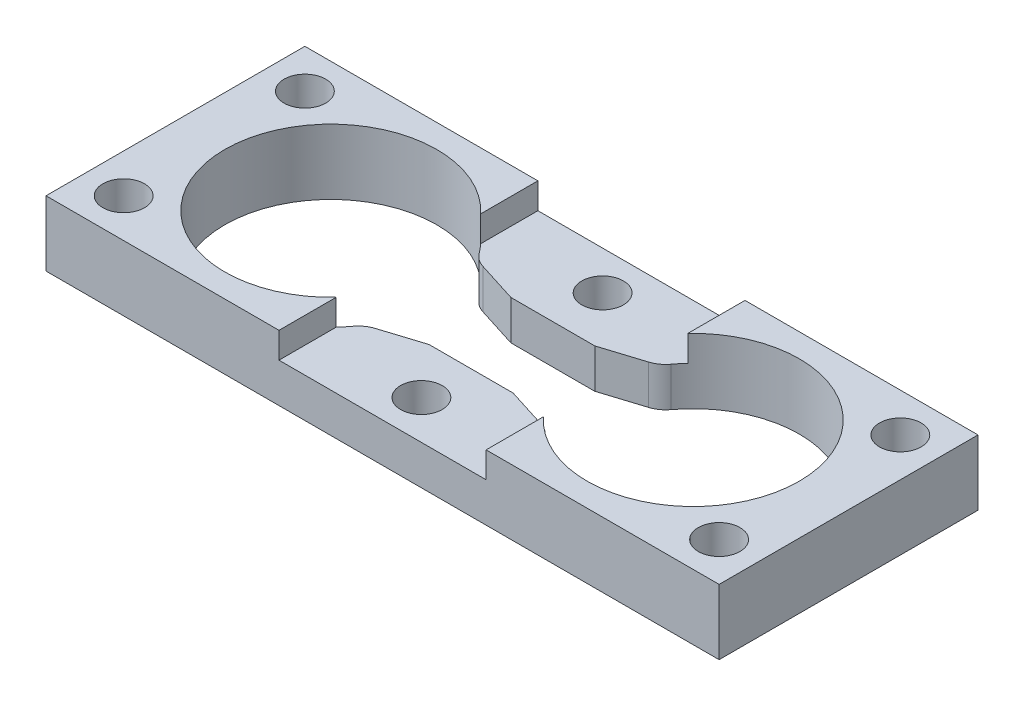
ISO-10303-21;
HEADER;
FILE_DESCRIPTION(('STEP AP214'),'2;1');
FILE_NAME('part.step','',(''),(''),'','','');
FILE_SCHEMA(('AUTOMOTIVE_DESIGN { 1 0 10303 214 1 1 1 1 }'));
ENDSEC;
DATA;
#1=APPLICATION_CONTEXT('core data for automotive mechanical design processes');
#2=APPLICATION_PROTOCOL_DEFINITION('international standard','automotive_design',2000,#1);
#3=PRODUCT_CONTEXT('',#1,'mechanical');
#4=PRODUCT('Part','Part','',(#3));
#5=PRODUCT_RELATED_PRODUCT_CATEGORY('part','',(#4));
#6=PRODUCT_DEFINITION_FORMATION('','',#4);
#7=PRODUCT_DEFINITION_CONTEXT('part definition',#1,'design');
#8=PRODUCT_DEFINITION('design','',#6,#7);
#9=PRODUCT_DEFINITION_SHAPE('','',#8);
#10=(LENGTH_UNIT() NAMED_UNIT(*) SI_UNIT(.MILLI.,.METRE.));
#11=(NAMED_UNIT(*) PLANE_ANGLE_UNIT() SI_UNIT($,.RADIAN.));
#12=(NAMED_UNIT(*) SI_UNIT($,.STERADIAN.) SOLID_ANGLE_UNIT());
#13=UNCERTAINTY_MEASURE_WITH_UNIT(LENGTH_MEASURE(1.E-05),#10,'distance_accuracy_value','');
#14=(GEOMETRIC_REPRESENTATION_CONTEXT(3) GLOBAL_UNCERTAINTY_ASSIGNED_CONTEXT((#13)) GLOBAL_UNIT_ASSIGNED_CONTEXT((#10,
#11,#12)) REPRESENTATION_CONTEXT('',''));
#15=CARTESIAN_POINT('',(0.,0.,0.));
#16=DIRECTION('',(0.,0.,1.));
#17=DIRECTION('',(1.,0.,0.));
#18=AXIS2_PLACEMENT_3D('',#15,#16,#17);
#19=CARTESIAN_POINT('',(0.,4.,0.));
#20=DIRECTION('',(0.,-1.,0.));
#21=DIRECTION('',(0.,0.,-1.));
#22=AXIS2_PLACEMENT_3D('',#19,#20,#21);
#23=PLANE('',#22);
#24=CARTESIAN_POINT('',(-36.5125,4.,-11.1125));
#25=DIRECTION('',(0.,1.,0.));
#26=DIRECTION('',(0.,0.,1.));
#27=AXIS2_PLACEMENT_3D('',#24,#25,#26);
#28=CIRCLE('',#27,2.5527);
#29=CARTESIAN_POINT('',(-36.5125,4.,-8.5598));
#30=VERTEX_POINT('',#29);
#31=EDGE_CURVE('E308',#30,#30,#28,.T.);
#32=ORIENTED_EDGE('',*,*,#31,.F.);
#33=EDGE_LOOP('',(#32));
#34=FACE_BOUND('',#33,.T.);
#35=CARTESIAN_POINT('',(-36.5125,4.,11.1125));
#36=DIRECTION('',(0.,1.,0.));
#37=DIRECTION('',(0.,0.,1.));
#38=AXIS2_PLACEMENT_3D('',#35,#36,#37);
#39=CIRCLE('',#38,2.5527);
#40=CARTESIAN_POINT('',(-36.5125,4.,13.6652));
#41=VERTEX_POINT('',#40);
#42=EDGE_CURVE('E326',#41,#41,#39,.T.);
#43=ORIENTED_EDGE('',*,*,#42,.F.);
#44=EDGE_LOOP('',(#43));
#45=FACE_BOUND('',#44,.T.);
#46=DIRECTION('',(1.,0.,0.));
#47=VECTOR('',#46,1.);
#48=CARTESIAN_POINT('',(-41.275,4.,15.875));
#49=LINE('',#48,#47);
#50=CARTESIAN_POINT('',(-41.275,4.,15.875));
#51=VERTEX_POINT('',#50);
#52=CARTESIAN_POINT('',(-12.7,4.,15.875));
#53=VERTEX_POINT('',#52);
#54=EDGE_CURVE('E349',#51,#53,#49,.T.);
#55=ORIENTED_EDGE('',*,*,#54,.T.);
#56=DIRECTION('',(0.,0.,1.));
#57=VECTOR('',#56,1.);
#58=CARTESIAN_POINT('',(-12.7,4.,-15.875));
#59=LINE('',#58,#57);
#60=CARTESIAN_POINT('',(-12.7,4.,8.85903149334057));
#61=VERTEX_POINT('',#60);
#62=EDGE_CURVE('E232',#61,#53,#59,.T.);
#63=ORIENTED_EDGE('',*,*,#62,.F.);
#64=CARTESIAN_POINT('',(-22.225,4.,0.));
#65=DIRECTION('',(0.,1.,0.));
#66=DIRECTION('',(0.,0.,1.));
#67=AXIS2_PLACEMENT_3D('',#64,#65,#66);
#68=CIRCLE('',#67,13.008);
#69=CARTESIAN_POINT('',(-12.7,4.,-8.85903149334057));
#70=VERTEX_POINT('',#69);
#71=EDGE_CURVE('E297',#70,#61,#68,.T.);
#72=ORIENTED_EDGE('',*,*,#71,.F.);
#73=CARTESIAN_POINT('',(-12.7,4.,-15.875));
#74=VERTEX_POINT('',#73);
#75=EDGE_CURVE('E229',#74,#70,#59,.T.);
#76=ORIENTED_EDGE('',*,*,#75,.F.);
#77=DIRECTION('',(-1.,0.,0.));
#78=VECTOR('',#77,1.);
#79=CARTESIAN_POINT('',(-41.275,4.,-15.875));
#80=LINE('',#79,#78);
#81=CARTESIAN_POINT('',(-41.275,4.,-15.875));
#82=VERTEX_POINT('',#81);
#83=EDGE_CURVE('E217',#74,#82,#80,.T.);
#84=ORIENTED_EDGE('',*,*,#83,.T.);
#85=DIRECTION('',(0.,0.,1.));
#86=VECTOR('',#85,1.);
#87=CARTESIAN_POINT('',(-41.275,4.,15.875));
#88=LINE('',#87,#86);
#89=EDGE_CURVE('E346',#82,#51,#88,.T.);
#90=ORIENTED_EDGE('',*,*,#89,.T.);
#91=EDGE_LOOP('',(#55,#63,#72,#76,#84,#90));
#92=FACE_BOUND('',#91,.T.);
#93=ADVANCED_FACE('F33',(#34,#45,#92),#23,.F.);
#94=CARTESIAN_POINT('',(36.5125,4.,11.1125));
#95=DIRECTION('',(0.,1.,0.));
#96=DIRECTION('',(0.,0.,1.));
#97=AXIS2_PLACEMENT_3D('',#94,#95,#96);
#98=CIRCLE('',#97,2.5527);
#99=CARTESIAN_POINT('',(36.5125,4.,13.6652));
#100=VERTEX_POINT('',#99);
#101=EDGE_CURVE('E320',#100,#100,#98,.T.);
#102=ORIENTED_EDGE('',*,*,#101,.F.);
#103=EDGE_LOOP('',(#102));
#104=FACE_BOUND('',#103,.T.);
#105=CARTESIAN_POINT('',(36.5125,4.,-11.1125));
#106=DIRECTION('',(0.,1.,0.));
#107=DIRECTION('',(0.,0.,1.));
#108=AXIS2_PLACEMENT_3D('',#105,#106,#107);
#109=CIRCLE('',#108,2.5527);
#110=CARTESIAN_POINT('',(36.5125,4.,-8.5598));
#111=VERTEX_POINT('',#110);
#112=EDGE_CURVE('E314',#111,#111,#109,.T.);
#113=ORIENTED_EDGE('',*,*,#112,.F.);
#114=EDGE_LOOP('',(#113));
#115=FACE_BOUND('',#114,.T.);
#116=CARTESIAN_POINT('',(41.275,4.,-15.875));
#117=VERTEX_POINT('',#116);
#118=CARTESIAN_POINT('',(12.7,4.,-15.875));
#119=VERTEX_POINT('',#118);
#120=EDGE_CURVE('E343',#117,#119,#80,.T.);
#121=ORIENTED_EDGE('',*,*,#120,.T.);
#122=DIRECTION('',(0.,0.,1.));
#123=VECTOR('',#122,1.);
#124=CARTESIAN_POINT('',(12.7,4.,-15.875));
#125=LINE('',#124,#123);
#126=CARTESIAN_POINT('',(12.7,4.,-8.85903149334057));
#127=VERTEX_POINT('',#126);
#128=EDGE_CURVE('E233',#119,#127,#125,.T.);
#129=ORIENTED_EDGE('',*,*,#128,.T.);
#130=CARTESIAN_POINT('',(22.225,4.,0.));
#131=DIRECTION('',(0.,-1.,0.));
#132=DIRECTION('',(0.,0.,1.));
#133=AXIS2_PLACEMENT_3D('',#130,#131,#132);
#134=CIRCLE('',#133,13.008);
#135=CARTESIAN_POINT('',(12.7,4.,8.85903149334057));
#136=VERTEX_POINT('',#135);
#137=EDGE_CURVE('E273',#127,#136,#134,.T.);
#138=ORIENTED_EDGE('',*,*,#137,.T.);
#139=CARTESIAN_POINT('',(12.7,4.,15.875));
#140=VERTEX_POINT('',#139);
#141=EDGE_CURVE('E236',#136,#140,#125,.T.);
#142=ORIENTED_EDGE('',*,*,#141,.T.);
#143=CARTESIAN_POINT('',(41.275,4.,15.875));
#144=VERTEX_POINT('',#143);
#145=EDGE_CURVE('E348',#140,#144,#49,.T.);
#146=ORIENTED_EDGE('',*,*,#145,.T.);
#147=DIRECTION('',(0.,0.,-1.));
#148=VECTOR('',#147,1.);
#149=CARTESIAN_POINT('',(41.275,4.,15.875));
#150=LINE('',#149,#148);
#151=EDGE_CURVE('E339',#144,#117,#150,.T.);
#152=ORIENTED_EDGE('',*,*,#151,.T.);
#153=EDGE_LOOP('',(#121,#129,#138,#142,#146,#152));
#154=FACE_BOUND('',#153,.T.);
#155=ADVANCED_FACE('F478',(#104,#115,#154),#23,.F.);
#156=CARTESIAN_POINT('',(0.,-4.,0.));
#157=DIRECTION('',(0.,-1.,0.));
#158=DIRECTION('',(0.,0.,-1.));
#159=AXIS2_PLACEMENT_3D('',#156,#157,#158);
#160=PLANE('',#159);
#161=CARTESIAN_POINT('',(-36.5125,-4.,-11.1125));
#162=DIRECTION('',(0.,1.,0.));
#163=DIRECTION('',(0.,0.,1.));
#164=AXIS2_PLACEMENT_3D('',#161,#162,#163);
#165=CIRCLE('',#164,2.5527);
#166=CARTESIAN_POINT('',(-36.5125,-4.,-8.5598));
#167=VERTEX_POINT('',#166);
#168=EDGE_CURVE('E311',#167,#167,#165,.T.);
#169=ORIENTED_EDGE('',*,*,#168,.T.);
#170=EDGE_LOOP('',(#169));
#171=FACE_BOUND('',#170,.T.);
#172=CARTESIAN_POINT('',(36.5125,-4.,-11.1125));
#173=DIRECTION('',(0.,1.,0.));
#174=DIRECTION('',(0.,0.,1.));
#175=AXIS2_PLACEMENT_3D('',#172,#173,#174);
#176=CIRCLE('',#175,2.5527);
#177=CARTESIAN_POINT('',(36.5125,-4.,-8.5598));
#178=VERTEX_POINT('',#177);
#179=EDGE_CURVE('E317',#178,#178,#176,.T.);
#180=ORIENTED_EDGE('',*,*,#179,.T.);
#181=EDGE_LOOP('',(#180));
#182=FACE_BOUND('',#181,.T.);
#183=CARTESIAN_POINT('',(36.5125,-4.,11.1125));
#184=DIRECTION('',(0.,1.,0.));
#185=DIRECTION('',(0.,0.,1.));
#186=AXIS2_PLACEMENT_3D('',#183,#184,#185);
#187=CIRCLE('',#186,2.5527);
#188=CARTESIAN_POINT('',(36.5125,-4.,13.6652));
#189=VERTEX_POINT('',#188);
#190=EDGE_CURVE('E323',#189,#189,#187,.T.);
#191=ORIENTED_EDGE('',*,*,#190,.T.);
#192=EDGE_LOOP('',(#191));
#193=FACE_BOUND('',#192,.T.);
#194=CARTESIAN_POINT('',(-36.5125,-4.,11.1125));
#195=DIRECTION('',(0.,1.,0.));
#196=DIRECTION('',(0.,0.,1.));
#197=AXIS2_PLACEMENT_3D('',#194,#195,#196);
#198=CIRCLE('',#197,2.5527);
#199=CARTESIAN_POINT('',(-36.5125,-4.,13.6652));
#200=VERTEX_POINT('',#199);
#201=EDGE_CURVE('E329',#200,#200,#198,.T.);
#202=ORIENTED_EDGE('',*,*,#201,.T.);
#203=EDGE_LOOP('',(#202));
#204=FACE_BOUND('',#203,.T.);
#205=CARTESIAN_POINT('',(0.,-4.,11.1125));
#206=DIRECTION('',(0.,1.,0.));
#207=DIRECTION('',(0.,0.,1.));
#208=AXIS2_PLACEMENT_3D('',#205,#206,#207);
#209=CIRCLE('',#208,2.5527);
#210=CARTESIAN_POINT('',(0.,-4.,13.6652));
#211=VERTEX_POINT('',#210);
#212=EDGE_CURVE('E332',#211,#211,#209,.T.);
#213=ORIENTED_EDGE('',*,*,#212,.T.);
#214=EDGE_LOOP('',(#213));
#215=FACE_BOUND('',#214,.T.);
#216=CARTESIAN_POINT('',(0.,-4.,-11.1125));
#217=DIRECTION('',(0.,1.,0.));
#218=DIRECTION('',(0.,0.,1.));
#219=AXIS2_PLACEMENT_3D('',#216,#217,#218);
#220=CIRCLE('',#219,2.5527);
#221=CARTESIAN_POINT('',(0.,-4.,-8.5598));
#222=VERTEX_POINT('',#221);
#223=EDGE_CURVE('E335',#222,#222,#220,.T.);
#224=ORIENTED_EDGE('',*,*,#223,.T.);
#225=EDGE_LOOP('',(#224));
#226=FACE_BOUND('',#225,.T.);
#227=DIRECTION('',(0.,0.,-1.));
#228=VECTOR('',#227,1.);
#229=CARTESIAN_POINT('',(41.275,-4.,15.875));
#230=LINE('',#229,#228);
#231=CARTESIAN_POINT('',(41.275,-4.,15.875));
#232=VERTEX_POINT('',#231);
#233=CARTESIAN_POINT('',(41.275,-4.,-15.875));
#234=VERTEX_POINT('',#233);
#235=EDGE_CURVE('E338',#232,#234,#230,.T.);
#236=ORIENTED_EDGE('',*,*,#235,.F.);
#237=DIRECTION('',(1.,0.,0.));
#238=VECTOR('',#237,1.);
#239=CARTESIAN_POINT('',(-41.275,-4.,15.875));
#240=LINE('',#239,#238);
#241=CARTESIAN_POINT('',(-41.275,-4.,15.875));
#242=VERTEX_POINT('',#241);
#243=EDGE_CURVE('E342',#242,#232,#240,.T.);
#244=ORIENTED_EDGE('',*,*,#243,.F.);
#245=DIRECTION('',(0.,0.,1.));
#246=VECTOR('',#245,1.);
#247=CARTESIAN_POINT('',(-41.275,-4.,15.875));
#248=LINE('',#247,#246);
#249=CARTESIAN_POINT('',(-41.275,-4.,-15.875));
#250=VERTEX_POINT('',#249);
#251=EDGE_CURVE('E357',#250,#242,#248,.T.);
#252=ORIENTED_EDGE('',*,*,#251,.F.);
#253=DIRECTION('',(-1.,0.,0.));
#254=VECTOR('',#253,1.);
#255=CARTESIAN_POINT('',(-41.275,-4.,-15.875));
#256=LINE('',#255,#254);
#257=EDGE_CURVE('E355',#234,#250,#256,.T.);
#258=ORIENTED_EDGE('',*,*,#257,.F.);
#259=EDGE_LOOP('',(#236,#244,#252,#258));
#260=FACE_BOUND('',#259,.T.);
#261=DIRECTION('',(-0.953440193148594,0.,-0.301582158107491));
#262=VECTOR('',#261,1.);
#263=CARTESIAN_POINT('',(5.14657234357318,-4.,5.008));
#264=LINE('',#263,#262);
#265=CARTESIAN_POINT('',(10.1730180433246,-4.,6.59791235384693));
#266=VERTEX_POINT('',#265);
#267=CARTESIAN_POINT('',(5.14657234357318,-4.,5.008));
#268=VERTEX_POINT('',#267);
#269=EDGE_CURVE('E271',#266,#268,#264,.T.);
#270=ORIENTED_EDGE('',*,*,#269,.F.);
#271=CARTESIAN_POINT('',(9.21549469133332,-4.,9.62508496709371));
#272=DIRECTION('',(0.,-1.,0.));
#273=DIRECTION('',(0.,0.,-1.));
#274=AXIS2_PLACEMENT_3D('',#271,#272,#273);
#275=CIRCLE('',#274,3.175);
#276=CARTESIAN_POINT('',(11.767875545008,-4.,7.73670550898814));
#277=VERTEX_POINT('',#276);
#278=EDGE_CURVE('E384',#266,#277,#275,.T.);
#279=ORIENTED_EDGE('',*,*,#278,.T.);
#280=CARTESIAN_POINT('',(22.225,-4.,0.));
#281=DIRECTION('',(0.,-1.,0.));
#282=DIRECTION('',(0.,0.,-1.));
#283=AXIS2_PLACEMENT_3D('',#280,#281,#282);
#284=CIRCLE('',#283,13.008);
#285=CARTESIAN_POINT('',(11.767875545008,-4.,-7.73670550898814));
#286=VERTEX_POINT('',#285);
#287=EDGE_CURVE('E268',#286,#277,#284,.T.);
#288=ORIENTED_EDGE('',*,*,#287,.F.);
#289=CARTESIAN_POINT('',(9.21549469133332,-4.,-9.62508496709371));
#290=DIRECTION('',(0.,-1.,0.));
#291=DIRECTION('',(0.,0.,-1.));
#292=AXIS2_PLACEMENT_3D('',#289,#290,#291);
#293=CIRCLE('',#292,3.175);
#294=CARTESIAN_POINT('',(10.1730180433246,-4.,-6.59791235384693));
#295=VERTEX_POINT('',#294);
#296=EDGE_CURVE('E380',#286,#295,#293,.T.);
#297=ORIENTED_EDGE('',*,*,#296,.T.);
#298=DIRECTION('',(0.953440193148594,0.,-0.301582158107491));
#299=VECTOR('',#298,1.);
#300=CARTESIAN_POINT('',(11.2151308372476,-4.,-6.92754249493093));
#301=LINE('',#300,#299);
#302=CARTESIAN_POINT('',(5.14657234357318,-4.,-5.008));
#303=VERTEX_POINT('',#302);
#304=EDGE_CURVE('E280',#303,#295,#301,.T.);
#305=ORIENTED_EDGE('',*,*,#304,.F.);
#306=DIRECTION('',(-1.,0.,0.));
#307=VECTOR('',#306,1.);
#308=CARTESIAN_POINT('',(-5.14657234357318,-4.,-5.008));
#309=LINE('',#308,#307);
#310=CARTESIAN_POINT('',(-5.14657234357318,-4.,-5.008));
#311=VERTEX_POINT('',#310);
#312=EDGE_CURVE('E288',#303,#311,#309,.T.);
#313=ORIENTED_EDGE('',*,*,#312,.T.);
#314=DIRECTION('',(-0.953440193148594,0.,-0.301582158107491));
#315=VECTOR('',#314,1.);
#316=CARTESIAN_POINT('',(-11.2151308372476,-4.,-6.92754249493093));
#317=LINE('',#316,#315);
#318=CARTESIAN_POINT('',(-10.1730180433246,-4.,-6.59791235384693));
#319=VERTEX_POINT('',#318);
#320=EDGE_CURVE('E291',#311,#319,#317,.T.);
#321=ORIENTED_EDGE('',*,*,#320,.T.);
#322=CARTESIAN_POINT('',(-9.21549469133332,-4.,-9.62508496709371));
#323=DIRECTION('',(0.,-1.,0.));
#324=DIRECTION('',(0.,0.,-1.));
#325=AXIS2_PLACEMENT_3D('',#322,#323,#324);
#326=CIRCLE('',#325,3.175);
#327=CARTESIAN_POINT('',(-11.767875545008,-4.,-7.73670550898814));
#328=VERTEX_POINT('',#327);
#329=EDGE_CURVE('E378',#319,#328,#326,.T.);
#330=ORIENTED_EDGE('',*,*,#329,.T.);
#331=CARTESIAN_POINT('',(-22.225,-4.,0.));
#332=DIRECTION('',(0.,-1.,0.));
#333=DIRECTION('',(0.,0.,-1.));
#334=AXIS2_PLACEMENT_3D('',#331,#332,#333);
#335=CIRCLE('',#334,13.008);
#336=CARTESIAN_POINT('',(-11.767875545008,-4.,7.73670550898814));
#337=VERTEX_POINT('',#336);
#338=EDGE_CURVE('E294',#328,#337,#335,.F.);
#339=ORIENTED_EDGE('',*,*,#338,.T.);
#340=CARTESIAN_POINT('',(-9.21549469133332,-4.,9.62508496709371));
#341=DIRECTION('',(0.,-1.,0.));
#342=DIRECTION('',(0.,0.,-1.));
#343=AXIS2_PLACEMENT_3D('',#340,#341,#342);
#344=CIRCLE('',#343,3.175);
#345=CARTESIAN_POINT('',(-10.1730180433246,-4.,6.59791235384693));
#346=VERTEX_POINT('',#345);
#347=EDGE_CURVE('E382',#337,#346,#344,.T.);
#348=ORIENTED_EDGE('',*,*,#347,.T.);
#349=DIRECTION('',(0.953440193148594,0.,-0.301582158107491));
#350=VECTOR('',#349,1.);
#351=CARTESIAN_POINT('',(-5.14657234357318,-4.,5.008));
#352=LINE('',#351,#350);
#353=CARTESIAN_POINT('',(-5.14657234357318,-4.,5.008));
#354=VERTEX_POINT('',#353);
#355=EDGE_CURVE('E304',#346,#354,#352,.T.);
#356=ORIENTED_EDGE('',*,*,#355,.T.);
#357=DIRECTION('',(1.,0.,0.));
#358=VECTOR('',#357,1.);
#359=CARTESIAN_POINT('',(0.508000000000001,-4.,5.008));
#360=LINE('',#359,#358);
#361=EDGE_CURVE('E285',#354,#268,#360,.T.);
#362=ORIENTED_EDGE('',*,*,#361,.T.);
#363=EDGE_LOOP('',(#270,#279,#288,#297,#305,#313,#321,#330,#339,#348,#356,#362));
#364=FACE_BOUND('',#363,.T.);
#365=ADVANCED_FACE('F433',(#171,#182,#193,#204,#215,#226,#260,#364),#160,.T.);
#366=CARTESIAN_POINT('',(41.275,4.,15.875));
#367=DIRECTION('',(-1.,0.,0.));
#368=DIRECTION('',(0.,0.,1.));
#369=AXIS2_PLACEMENT_3D('',#366,#367,#368);
#370=PLANE('',#369);
#371=ORIENTED_EDGE('',*,*,#235,.T.);
#372=DIRECTION('',(0.,-1.,0.));
#373=VECTOR('',#372,1.);
#374=CARTESIAN_POINT('',(41.275,4.,-15.875));
#375=LINE('',#374,#373);
#376=EDGE_CURVE('E368',#117,#234,#375,.T.);
#377=ORIENTED_EDGE('',*,*,#376,.F.);
#378=ORIENTED_EDGE('',*,*,#151,.F.);
#379=DIRECTION('',(0.,-1.,0.));
#380=VECTOR('',#379,1.);
#381=CARTESIAN_POINT('',(41.275,4.,15.875));
#382=LINE('',#381,#380);
#383=EDGE_CURVE('E352',#144,#232,#382,.T.);
#384=ORIENTED_EDGE('',*,*,#383,.T.);
#385=EDGE_LOOP('',(#371,#377,#378,#384));
#386=FACE_BOUND('',#385,.T.);
#387=ADVANCED_FACE('F484',(#386),#370,.F.);
#388=CARTESIAN_POINT('',(-41.275,4.,-15.875));
#389=DIRECTION('',(0.,0.,1.));
#390=DIRECTION('',(1.,0.,0.));
#391=AXIS2_PLACEMENT_3D('',#388,#389,#390);
#392=PLANE('',#391);
#393=ORIENTED_EDGE('',*,*,#83,.F.);
#394=DIRECTION('',(0.,-1.,0.));
#395=VECTOR('',#394,1.);
#396=CARTESIAN_POINT('',(-12.7,4.,-15.875));
#397=LINE('',#396,#395);
#398=CARTESIAN_POINT('',(-12.7,0.825,-15.875));
#399=VERTEX_POINT('',#398);
#400=EDGE_CURVE('E197',#74,#399,#397,.T.);
#401=ORIENTED_EDGE('',*,*,#400,.T.);
#402=DIRECTION('',(1.,0.,0.));
#403=VECTOR('',#402,1.);
#404=CARTESIAN_POINT('',(-12.7,0.825,-15.875));
#405=LINE('',#404,#403);
#406=CARTESIAN_POINT('',(12.7,0.825,-15.875));
#407=VERTEX_POINT('',#406);
#408=EDGE_CURVE('E204',#399,#407,#405,.T.);
#409=ORIENTED_EDGE('',*,*,#408,.T.);
#410=DIRECTION('',(0.,1.,0.));
#411=VECTOR('',#410,1.);
#412=CARTESIAN_POINT('',(12.7,4.,-15.875));
#413=LINE('',#412,#411);
#414=EDGE_CURVE('E212',#407,#119,#413,.T.);
#415=ORIENTED_EDGE('',*,*,#414,.T.);
#416=ORIENTED_EDGE('',*,*,#120,.F.);
#417=ORIENTED_EDGE('',*,*,#376,.T.);
#418=ORIENTED_EDGE('',*,*,#257,.T.);
#419=DIRECTION('',(0.,-1.,0.));
#420=VECTOR('',#419,1.);
#421=CARTESIAN_POINT('',(-41.275,4.,-15.875));
#422=LINE('',#421,#420);
#423=EDGE_CURVE('E365',#82,#250,#422,.T.);
#424=ORIENTED_EDGE('',*,*,#423,.F.);
#425=EDGE_LOOP('',(#393,#401,#409,#415,#416,#417,#418,#424));
#426=FACE_BOUND('',#425,.T.);
#427=ADVANCED_FACE('F215',(#426),#392,.F.);
#428=CARTESIAN_POINT('',(-41.275,4.,15.875));
#429=DIRECTION('',(1.,0.,0.));
#430=DIRECTION('',(0.,0.,-1.));
#431=AXIS2_PLACEMENT_3D('',#428,#429,#430);
#432=PLANE('',#431);
#433=ORIENTED_EDGE('',*,*,#251,.T.);
#434=DIRECTION('',(0.,-1.,0.));
#435=VECTOR('',#434,1.);
#436=CARTESIAN_POINT('',(-41.275,4.,15.875));
#437=LINE('',#436,#435);
#438=EDGE_CURVE('E362',#51,#242,#437,.T.);
#439=ORIENTED_EDGE('',*,*,#438,.F.);
#440=ORIENTED_EDGE('',*,*,#89,.F.);
#441=ORIENTED_EDGE('',*,*,#423,.T.);
#442=EDGE_LOOP('',(#433,#439,#440,#441));
#443=FACE_BOUND('',#442,.T.);
#444=ADVANCED_FACE('F491',(#443),#432,.F.);
#445=CARTESIAN_POINT('',(-41.275,4.,15.875));
#446=DIRECTION('',(0.,0.,-1.));
#447=DIRECTION('',(-1.,0.,0.));
#448=AXIS2_PLACEMENT_3D('',#445,#446,#447);
#449=PLANE('',#448);
#450=DIRECTION('',(1.,0.,0.));
#451=VECTOR('',#450,1.);
#452=CARTESIAN_POINT('',(-12.7,0.825,15.875));
#453=LINE('',#452,#451);
#454=CARTESIAN_POINT('',(-12.7,0.825,15.875));
#455=VERTEX_POINT('',#454);
#456=CARTESIAN_POINT('',(12.7,0.825,15.875));
#457=VERTEX_POINT('',#456);
#458=EDGE_CURVE('E220',#455,#457,#453,.T.);
#459=ORIENTED_EDGE('',*,*,#458,.F.);
#460=DIRECTION('',(0.,-1.,0.));
#461=VECTOR('',#460,1.);
#462=CARTESIAN_POINT('',(-12.7,4.,15.875));
#463=LINE('',#462,#461);
#464=EDGE_CURVE('E224',#53,#455,#463,.T.);
#465=ORIENTED_EDGE('',*,*,#464,.F.);
#466=ORIENTED_EDGE('',*,*,#54,.F.);
#467=ORIENTED_EDGE('',*,*,#438,.T.);
#468=ORIENTED_EDGE('',*,*,#243,.T.);
#469=ORIENTED_EDGE('',*,*,#383,.F.);
#470=ORIENTED_EDGE('',*,*,#145,.F.);
#471=DIRECTION('',(0.,1.,0.));
#472=VECTOR('',#471,1.);
#473=CARTESIAN_POINT('',(12.7,4.,15.875));
#474=LINE('',#473,#472);
#475=EDGE_CURVE('E218',#457,#140,#474,.T.);
#476=ORIENTED_EDGE('',*,*,#475,.F.);
#477=EDGE_LOOP('',(#459,#465,#466,#467,#468,#469,#470,#476));
#478=FACE_BOUND('',#477,.T.);
#479=ADVANCED_FACE('F416',(#478),#449,.F.);
#480=CARTESIAN_POINT('',(0.,4.,-11.1125));
#481=DIRECTION('',(0.,1.,0.));
#482=DIRECTION('',(0.,0.,1.));
#483=AXIS2_PLACEMENT_3D('',#480,#481,#482);
#484=CYLINDRICAL_SURFACE('',#483,2.5527);
#485=CARTESIAN_POINT('',(0.,0.825,-11.1125));
#486=DIRECTION('',(0.,-1.,0.));
#487=DIRECTION('',(0.,0.,-1.));
#488=AXIS2_PLACEMENT_3D('',#485,#486,#487);
#489=CIRCLE('',#488,2.5527);
#490=CARTESIAN_POINT('',(0.,0.825,-13.6652));
#491=VERTEX_POINT('',#490);
#492=EDGE_CURVE('E265',#491,#491,#489,.F.);
#493=ORIENTED_EDGE('',*,*,#492,.T.);
#494=EDGE_LOOP('',(#493));
#495=FACE_BOUND('',#494,.T.);
#496=ORIENTED_EDGE('',*,*,#223,.F.);
#497=EDGE_LOOP('',(#496));
#498=FACE_BOUND('',#497,.T.);
#499=ADVANCED_FACE('F513',(#495,#498),#484,.F.);
#500=CARTESIAN_POINT('',(0.,4.,11.1125));
#501=DIRECTION('',(0.,1.,0.));
#502=DIRECTION('',(0.,0.,1.));
#503=AXIS2_PLACEMENT_3D('',#500,#501,#502);
#504=CYLINDRICAL_SURFACE('',#503,2.5527);
#505=CARTESIAN_POINT('',(0.,0.825,11.1125));
#506=DIRECTION('',(0.,-1.,0.));
#507=DIRECTION('',(0.,0.,-1.));
#508=AXIS2_PLACEMENT_3D('',#505,#506,#507);
#509=CIRCLE('',#508,2.5527);
#510=CARTESIAN_POINT('',(0.,0.825,8.5598));
#511=VERTEX_POINT('',#510);
#512=EDGE_CURVE('E262',#511,#511,#509,.F.);
#513=ORIENTED_EDGE('',*,*,#512,.T.);
#514=EDGE_LOOP('',(#513));
#515=FACE_BOUND('',#514,.T.);
#516=ORIENTED_EDGE('',*,*,#212,.F.);
#517=EDGE_LOOP('',(#516));
#518=FACE_BOUND('',#517,.T.);
#519=ADVANCED_FACE('F572',(#515,#518),#504,.F.);
#520=CARTESIAN_POINT('',(-36.5125,4.,11.1125));
#521=DIRECTION('',(0.,1.,0.));
#522=DIRECTION('',(0.,0.,1.));
#523=AXIS2_PLACEMENT_3D('',#520,#521,#522);
#524=CYLINDRICAL_SURFACE('',#523,2.5527);
#525=ORIENTED_EDGE('',*,*,#201,.F.);
#526=EDGE_LOOP('',(#525));
#527=FACE_BOUND('',#526,.T.);
#528=ORIENTED_EDGE('',*,*,#42,.T.);
#529=EDGE_LOOP('',(#528));
#530=FACE_BOUND('',#529,.T.);
#531=ADVANCED_FACE('F569',(#527,#530),#524,.F.);
#532=CARTESIAN_POINT('',(36.5125,4.,11.1125));
#533=DIRECTION('',(0.,1.,0.));
#534=DIRECTION('',(0.,0.,1.));
#535=AXIS2_PLACEMENT_3D('',#532,#533,#534);
#536=CYLINDRICAL_SURFACE('',#535,2.5527);
#537=ORIENTED_EDGE('',*,*,#190,.F.);
#538=EDGE_LOOP('',(#537));
#539=FACE_BOUND('',#538,.T.);
#540=ORIENTED_EDGE('',*,*,#101,.T.);
#541=EDGE_LOOP('',(#540));
#542=FACE_BOUND('',#541,.T.);
#543=ADVANCED_FACE('F565',(#539,#542),#536,.F.);
#544=CARTESIAN_POINT('',(36.5125,4.,-11.1125));
#545=DIRECTION('',(0.,1.,0.));
#546=DIRECTION('',(0.,0.,1.));
#547=AXIS2_PLACEMENT_3D('',#544,#545,#546);
#548=CYLINDRICAL_SURFACE('',#547,2.5527);
#549=ORIENTED_EDGE('',*,*,#179,.F.);
#550=EDGE_LOOP('',(#549));
#551=FACE_BOUND('',#550,.T.);
#552=ORIENTED_EDGE('',*,*,#112,.T.);
#553=EDGE_LOOP('',(#552));
#554=FACE_BOUND('',#553,.T.);
#555=ADVANCED_FACE('F561',(#551,#554),#548,.F.);
#556=CARTESIAN_POINT('',(-36.5125,4.,-11.1125));
#557=DIRECTION('',(0.,1.,0.));
#558=DIRECTION('',(0.,0.,1.));
#559=AXIS2_PLACEMENT_3D('',#556,#557,#558);
#560=CYLINDRICAL_SURFACE('',#559,2.5527);
#561=ORIENTED_EDGE('',*,*,#168,.F.);
#562=EDGE_LOOP('',(#561));
#563=FACE_BOUND('',#562,.T.);
#564=ORIENTED_EDGE('',*,*,#31,.T.);
#565=EDGE_LOOP('',(#564));
#566=FACE_BOUND('',#565,.T.);
#567=ADVANCED_FACE('F558',(#563,#566),#560,.F.);
#568=CARTESIAN_POINT('',(-22.225,-4.001,0.));
#569=DIRECTION('',(0.,1.,0.));
#570=DIRECTION('',(0.,0.,1.));
#571=AXIS2_PLACEMENT_3D('',#568,#569,#570);
#572=CYLINDRICAL_SURFACE('',#571,13.008);
#573=ORIENTED_EDGE('',*,*,#71,.T.);
#574=DIRECTION('',(0.,1.,0.));
#575=VECTOR('',#574,1.);
#576=CARTESIAN_POINT('',(-12.7,-4.001,8.85903149334057));
#577=LINE('',#576,#575);
#578=CARTESIAN_POINT('',(-12.7,0.825,8.85903149334057));
#579=VERTEX_POINT('',#578);
#580=EDGE_CURVE('E11',#61,#579,#577,.F.);
#581=ORIENTED_EDGE('',*,*,#580,.T.);
#582=CARTESIAN_POINT('',(-22.225,0.825,0.));
#583=DIRECTION('',(0.,-1.,0.));
#584=DIRECTION('',(0.,0.,-1.));
#585=AXIS2_PLACEMENT_3D('',#582,#583,#584);
#586=CIRCLE('',#585,13.008);
#587=CARTESIAN_POINT('',(-11.767875545008,0.825,7.73670550898814));
#588=VERTEX_POINT('',#587);
#589=EDGE_CURVE('E242',#579,#588,#586,.F.);
#590=ORIENTED_EDGE('',*,*,#589,.T.);
#591=DIRECTION('',(0.,1.,0.));
#592=VECTOR('',#591,1.);
#593=CARTESIAN_POINT('',(-11.767875545008,-4.001,7.73670550898814));
#594=LINE('',#593,#592);
#595=EDGE_CURVE('E392',#588,#337,#594,.F.);
#596=ORIENTED_EDGE('',*,*,#595,.T.);
#597=ORIENTED_EDGE('',*,*,#338,.F.);
#598=DIRECTION('',(0.,1.,0.));
#599=VECTOR('',#598,1.);
#600=CARTESIAN_POINT('',(-11.767875545008,-4.001,-7.73670550898814));
#601=LINE('',#600,#599);
#602=CARTESIAN_POINT('',(-11.767875545008,0.825,-7.73670550898814));
#603=VERTEX_POINT('',#602);
#604=EDGE_CURVE('E389',#328,#603,#601,.T.);
#605=ORIENTED_EDGE('',*,*,#604,.T.);
#606=CARTESIAN_POINT('',(-12.7,0.825,-8.85903149334057));
#607=VERTEX_POINT('',#606);
#608=EDGE_CURVE('E56',#603,#607,#586,.F.);
#609=ORIENTED_EDGE('',*,*,#608,.T.);
#610=DIRECTION('',(0.,1.,0.));
#611=VECTOR('',#610,1.);
#612=CARTESIAN_POINT('',(-12.7,-4.001,-8.85903149334057));
#613=LINE('',#612,#611);
#614=EDGE_CURVE('E41',#607,#70,#613,.T.);
#615=ORIENTED_EDGE('',*,*,#614,.T.);
#616=EDGE_LOOP('',(#573,#581,#590,#596,#597,#605,#609,#615));
#617=FACE_BOUND('',#616,.T.);
#618=ADVANCED_FACE('F406',(#617),#572,.F.);
#619=CARTESIAN_POINT('',(-11.2151308372476,-4.001,-6.92754249493093));
#620=DIRECTION('',(0.301582158107491,0.,-0.953440193148594));
#621=DIRECTION('',(-0.953440193148594,0.,-0.301582158107491));
#622=AXIS2_PLACEMENT_3D('',#619,#620,#621);
#623=PLANE('',#622);
#624=DIRECTION('',(0.,1.,0.));
#625=VECTOR('',#624,1.);
#626=CARTESIAN_POINT('',(-5.14657234357318,-4.001,-5.008));
#627=LINE('',#626,#625);
#628=CARTESIAN_POINT('',(-5.14657234357318,0.825,-5.008));
#629=VERTEX_POINT('',#628);
#630=EDGE_CURVE('E301',#311,#629,#627,.T.);
#631=ORIENTED_EDGE('',*,*,#630,.T.);
#632=DIRECTION('',(-0.953440193148594,0.,-0.301582158107491));
#633=VECTOR('',#632,1.);
#634=CARTESIAN_POINT('',(-11.2151308372476,0.825,-6.92754249493093));
#635=LINE('',#634,#633);
#636=CARTESIAN_POINT('',(-10.1730180433246,0.825,-6.59791235384693));
#637=VERTEX_POINT('',#636);
#638=EDGE_CURVE('E231',#629,#637,#635,.T.);
#639=ORIENTED_EDGE('',*,*,#638,.T.);
#640=DIRECTION('',(0.,1.,0.));
#641=VECTOR('',#640,1.);
#642=CARTESIAN_POINT('',(-10.1730180433246,-4.001,-6.59791235384693));
#643=LINE('',#642,#641);
#644=EDGE_CURVE('E397',#637,#319,#643,.F.);
#645=ORIENTED_EDGE('',*,*,#644,.T.);
#646=ORIENTED_EDGE('',*,*,#320,.F.);
#647=EDGE_LOOP('',(#631,#639,#645,#646));
#648=FACE_BOUND('',#647,.T.);
#649=ADVANCED_FACE('F469',(#648),#623,.F.);
#650=CARTESIAN_POINT('',(-5.14657234357318,-4.001,-5.008));
#651=DIRECTION('',(0.,0.,-1.));
#652=DIRECTION('',(-1.,0.,0.));
#653=AXIS2_PLACEMENT_3D('',#650,#651,#652);
#654=PLANE('',#653);
#655=DIRECTION('',(0.,1.,0.));
#656=VECTOR('',#655,1.);
#657=CARTESIAN_POINT('',(5.14657234357318,-4.001,-5.008));
#658=LINE('',#657,#656);
#659=CARTESIAN_POINT('',(5.14657234357318,0.825,-5.008));
#660=VERTEX_POINT('',#659);
#661=EDGE_CURVE('E276',#303,#660,#658,.T.);
#662=ORIENTED_EDGE('',*,*,#661,.T.);
#663=DIRECTION('',(-1.,0.,0.));
#664=VECTOR('',#663,1.);
#665=CARTESIAN_POINT('',(-5.14657234357318,0.825,-5.008));
#666=LINE('',#665,#664);
#667=EDGE_CURVE('E241',#660,#629,#666,.T.);
#668=ORIENTED_EDGE('',*,*,#667,.T.);
#669=ORIENTED_EDGE('',*,*,#630,.F.);
#670=ORIENTED_EDGE('',*,*,#312,.F.);
#671=EDGE_LOOP('',(#662,#668,#669,#670));
#672=FACE_BOUND('',#671,.T.);
#673=ADVANCED_FACE('F467',(#672),#654,.F.);
#674=CARTESIAN_POINT('',(0.508000000000001,-4.001,5.008));
#675=DIRECTION('',(0.,0.,1.));
#676=DIRECTION('',(1.,0.,0.));
#677=AXIS2_PLACEMENT_3D('',#674,#675,#676);
#678=PLANE('',#677);
#679=DIRECTION('',(0.,1.,0.));
#680=VECTOR('',#679,1.);
#681=CARTESIAN_POINT('',(-5.14657234357318,-4.001,5.008));
#682=LINE('',#681,#680);
#683=CARTESIAN_POINT('',(-5.14657234357318,0.825,5.008));
#684=VERTEX_POINT('',#683);
#685=EDGE_CURVE('E300',#354,#684,#682,.T.);
#686=ORIENTED_EDGE('',*,*,#685,.T.);
#687=DIRECTION('',(1.,0.,0.));
#688=VECTOR('',#687,1.);
#689=CARTESIAN_POINT('',(0.508000000000001,0.825,5.008));
#690=LINE('',#689,#688);
#691=CARTESIAN_POINT('',(5.14657234357318,0.825,5.008));
#692=VERTEX_POINT('',#691);
#693=EDGE_CURVE('E255',#684,#692,#690,.T.);
#694=ORIENTED_EDGE('',*,*,#693,.T.);
#695=DIRECTION('',(0.,1.,0.));
#696=VECTOR('',#695,1.);
#697=CARTESIAN_POINT('',(5.14657234357318,-4.001,5.008));
#698=LINE('',#697,#696);
#699=EDGE_CURVE('E277',#268,#692,#698,.T.);
#700=ORIENTED_EDGE('',*,*,#699,.F.);
#701=ORIENTED_EDGE('',*,*,#361,.F.);
#702=EDGE_LOOP('',(#686,#694,#700,#701));
#703=FACE_BOUND('',#702,.T.);
#704=ADVANCED_FACE('F440',(#703),#678,.F.);
#705=CARTESIAN_POINT('',(-5.14657234357318,-4.001,5.008));
#706=DIRECTION('',(0.301582158107491,0.,0.953440193148594));
#707=DIRECTION('',(0.953440193148594,0.,-0.301582158107491));
#708=AXIS2_PLACEMENT_3D('',#705,#706,#707);
#709=PLANE('',#708);
#710=DIRECTION('',(0.,1.,0.));
#711=VECTOR('',#710,1.);
#712=CARTESIAN_POINT('',(-10.1730180433246,-4.001,6.59791235384693));
#713=LINE('',#712,#711);
#714=CARTESIAN_POINT('',(-10.1730180433246,0.825,6.59791235384693));
#715=VERTEX_POINT('',#714);
#716=EDGE_CURVE('E386',#346,#715,#713,.T.);
#717=ORIENTED_EDGE('',*,*,#716,.T.);
#718=DIRECTION('',(0.953440193148594,0.,-0.301582158107491));
#719=VECTOR('',#718,1.);
#720=CARTESIAN_POINT('',(-5.14657234357318,0.825,5.008));
#721=LINE('',#720,#719);
#722=EDGE_CURVE('E48',#715,#684,#721,.T.);
#723=ORIENTED_EDGE('',*,*,#722,.T.);
#724=ORIENTED_EDGE('',*,*,#685,.F.);
#725=ORIENTED_EDGE('',*,*,#355,.F.);
#726=EDGE_LOOP('',(#717,#723,#724,#725));
#727=FACE_BOUND('',#726,.T.);
#728=ADVANCED_FACE('F436',(#727),#709,.F.);
#729=CARTESIAN_POINT('',(22.225,-4.001,0.));
#730=DIRECTION('',(0.,1.,0.));
#731=DIRECTION('',(0.,0.,1.));
#732=AXIS2_PLACEMENT_3D('',#729,#730,#731);
#733=CYLINDRICAL_SURFACE('',#732,13.008);
#734=DIRECTION('',(0.,1.,0.));
#735=VECTOR('',#734,1.);
#736=CARTESIAN_POINT('',(12.7,-4.001,8.85903149334057));
#737=LINE('',#736,#735);
#738=CARTESIAN_POINT('',(12.7,0.825,8.85903149334057));
#739=VERTEX_POINT('',#738);
#740=EDGE_CURVE('E403',#136,#739,#737,.F.);
#741=ORIENTED_EDGE('',*,*,#740,.F.);
#742=ORIENTED_EDGE('',*,*,#137,.F.);
#743=DIRECTION('',(0.,1.,0.));
#744=VECTOR('',#743,1.);
#745=CARTESIAN_POINT('',(12.7,-4.001,-8.85903149334057));
#746=LINE('',#745,#744);
#747=CARTESIAN_POINT('',(12.7,0.825,-8.85903149334057));
#748=VERTEX_POINT('',#747);
#749=EDGE_CURVE('E401',#748,#127,#746,.T.);
#750=ORIENTED_EDGE('',*,*,#749,.F.);
#751=CARTESIAN_POINT('',(22.225,0.825,0.));
#752=DIRECTION('',(0.,-1.,0.));
#753=DIRECTION('',(0.,0.,-1.));
#754=AXIS2_PLACEMENT_3D('',#751,#752,#753);
#755=CIRCLE('',#754,13.008);
#756=CARTESIAN_POINT('',(11.767875545008,0.825,-7.73670550898814));
#757=VERTEX_POINT('',#756);
#758=EDGE_CURVE('E249',#757,#748,#755,.T.);
#759=ORIENTED_EDGE('',*,*,#758,.F.);
#760=DIRECTION('',(0.,1.,0.));
#761=VECTOR('',#760,1.);
#762=CARTESIAN_POINT('',(11.767875545008,-4.001,-7.73670550898814));
#763=LINE('',#762,#761);
#764=EDGE_CURVE('E371',#757,#286,#763,.F.);
#765=ORIENTED_EDGE('',*,*,#764,.T.);
#766=ORIENTED_EDGE('',*,*,#287,.T.);
#767=DIRECTION('',(0.,1.,0.));
#768=VECTOR('',#767,1.);
#769=CARTESIAN_POINT('',(11.767875545008,-4.001,7.73670550898814));
#770=LINE('',#769,#768);
#771=CARTESIAN_POINT('',(11.767875545008,0.825,7.73670550898814));
#772=VERTEX_POINT('',#771);
#773=EDGE_CURVE('E373',#277,#772,#770,.T.);
#774=ORIENTED_EDGE('',*,*,#773,.T.);
#775=EDGE_CURVE('E252',#739,#772,#755,.T.);
#776=ORIENTED_EDGE('',*,*,#775,.F.);
#777=EDGE_LOOP('',(#741,#742,#750,#759,#765,#766,#774,#776));
#778=FACE_BOUND('',#777,.T.);
#779=ADVANCED_FACE('F451',(#778),#733,.F.);
#780=CARTESIAN_POINT('',(5.14657234357318,-4.001,5.008));
#781=DIRECTION('',(0.301582158107491,0.,-0.953440193148594));
#782=DIRECTION('',(-0.953440193148594,0.,-0.301582158107491));
#783=AXIS2_PLACEMENT_3D('',#780,#781,#782);
#784=PLANE('',#783);
#785=DIRECTION('',(-0.953440193148594,0.,-0.301582158107491));
#786=VECTOR('',#785,1.);
#787=CARTESIAN_POINT('',(5.14657234357318,0.825,5.008));
#788=LINE('',#787,#786);
#789=CARTESIAN_POINT('',(10.1730180433246,0.825,6.59791235384693));
#790=VERTEX_POINT('',#789);
#791=EDGE_CURVE('E258',#790,#692,#788,.T.);
#792=ORIENTED_EDGE('',*,*,#791,.F.);
#793=DIRECTION('',(0.,1.,0.));
#794=VECTOR('',#793,1.);
#795=CARTESIAN_POINT('',(10.1730180433246,-4.001,6.59791235384693));
#796=LINE('',#795,#794);
#797=EDGE_CURVE('E376',#790,#266,#796,.F.);
#798=ORIENTED_EDGE('',*,*,#797,.T.);
#799=ORIENTED_EDGE('',*,*,#269,.T.);
#800=ORIENTED_EDGE('',*,*,#699,.T.);
#801=EDGE_LOOP('',(#792,#798,#799,#800));
#802=FACE_BOUND('',#801,.T.);
#803=ADVANCED_FACE('F541',(#802),#784,.T.);
#804=CARTESIAN_POINT('',(11.2151308372476,-4.001,-6.92754249493093));
#805=DIRECTION('',(0.301582158107491,0.,0.953440193148594));
#806=DIRECTION('',(0.953440193148594,0.,-0.301582158107491));
#807=AXIS2_PLACEMENT_3D('',#804,#805,#806);
#808=PLANE('',#807);
#809=DIRECTION('',(0.953440193148594,0.,-0.301582158107491));
#810=VECTOR('',#809,1.);
#811=CARTESIAN_POINT('',(11.2151308372476,0.825,-6.92754249493093));
#812=LINE('',#811,#810);
#813=CARTESIAN_POINT('',(10.1730180433246,0.825,-6.59791235384693));
#814=VERTEX_POINT('',#813);
#815=EDGE_CURVE('E245',#660,#814,#812,.T.);
#816=ORIENTED_EDGE('',*,*,#815,.F.);
#817=ORIENTED_EDGE('',*,*,#661,.F.);
#818=ORIENTED_EDGE('',*,*,#304,.T.);
#819=DIRECTION('',(0.,1.,0.));
#820=VECTOR('',#819,1.);
#821=CARTESIAN_POINT('',(10.1730180433246,-4.001,-6.59791235384693));
#822=LINE('',#821,#820);
#823=EDGE_CURVE('E394',#295,#814,#822,.T.);
#824=ORIENTED_EDGE('',*,*,#823,.T.);
#825=EDGE_LOOP('',(#816,#817,#818,#824));
#826=FACE_BOUND('',#825,.T.);
#827=ADVANCED_FACE('F462',(#826),#808,.T.);
#828=CARTESIAN_POINT('',(9.21549469133332,-4.001,9.62508496709371));
#829=DIRECTION('',(0.,1.,0.));
#830=DIRECTION('',(0.,0.,1.));
#831=AXIS2_PLACEMENT_3D('',#828,#829,#830);
#832=CYLINDRICAL_SURFACE('',#831,3.175);
#833=CARTESIAN_POINT('',(9.21549469133332,0.825,9.62508496709371));
#834=DIRECTION('',(0.,-1.,0.));
#835=DIRECTION('',(0.,0.,-1.));
#836=AXIS2_PLACEMENT_3D('',#833,#834,#835);
#837=CIRCLE('',#836,3.175);
#838=EDGE_CURVE('E260',#772,#790,#837,.F.);
#839=ORIENTED_EDGE('',*,*,#838,.F.);
#840=ORIENTED_EDGE('',*,*,#773,.F.);
#841=ORIENTED_EDGE('',*,*,#278,.F.);
#842=ORIENTED_EDGE('',*,*,#797,.F.);
#843=EDGE_LOOP('',(#839,#840,#841,#842));
#844=FACE_BOUND('',#843,.T.);
#845=ADVANCED_FACE('F448',(#844),#832,.T.);
#846=CARTESIAN_POINT('',(-9.21549469133332,-4.001,9.62508496709371));
#847=DIRECTION('',(0.,1.,0.));
#848=DIRECTION('',(0.,0.,1.));
#849=AXIS2_PLACEMENT_3D('',#846,#847,#848);
#850=CYLINDRICAL_SURFACE('',#849,3.175);
#851=CARTESIAN_POINT('',(-9.21549469133332,0.825,9.62508496709371));
#852=DIRECTION('',(0.,-1.,0.));
#853=DIRECTION('',(0.,0.,-1.));
#854=AXIS2_PLACEMENT_3D('',#851,#852,#853);
#855=CIRCLE('',#854,3.175);
#856=EDGE_CURVE('E251',#715,#588,#855,.F.);
#857=ORIENTED_EDGE('',*,*,#856,.F.);
#858=ORIENTED_EDGE('',*,*,#716,.F.);
#859=ORIENTED_EDGE('',*,*,#347,.F.);
#860=ORIENTED_EDGE('',*,*,#595,.F.);
#861=EDGE_LOOP('',(#857,#858,#859,#860));
#862=FACE_BOUND('',#861,.T.);
#863=ADVANCED_FACE('F428',(#862),#850,.T.);
#864=CARTESIAN_POINT('',(9.21549469133332,-4.001,-9.62508496709371));
#865=DIRECTION('',(0.,1.,0.));
#866=DIRECTION('',(0.,0.,1.));
#867=AXIS2_PLACEMENT_3D('',#864,#865,#866);
#868=CYLINDRICAL_SURFACE('',#867,3.175);
#869=CARTESIAN_POINT('',(9.21549469133332,0.825,-9.62508496709371));
#870=DIRECTION('',(0.,-1.,0.));
#871=DIRECTION('',(0.,0.,-1.));
#872=AXIS2_PLACEMENT_3D('',#869,#870,#871);
#873=CIRCLE('',#872,3.175);
#874=EDGE_CURVE('E247',#814,#757,#873,.F.);
#875=ORIENTED_EDGE('',*,*,#874,.F.);
#876=ORIENTED_EDGE('',*,*,#823,.F.);
#877=ORIENTED_EDGE('',*,*,#296,.F.);
#878=ORIENTED_EDGE('',*,*,#764,.F.);
#879=EDGE_LOOP('',(#875,#876,#877,#878));
#880=FACE_BOUND('',#879,.T.);
#881=ADVANCED_FACE('F459',(#880),#868,.T.);
#882=CARTESIAN_POINT('',(-9.21549469133332,-4.001,-9.62508496709371));
#883=DIRECTION('',(0.,1.,0.));
#884=DIRECTION('',(0.,0.,1.));
#885=AXIS2_PLACEMENT_3D('',#882,#883,#884);
#886=CYLINDRICAL_SURFACE('',#885,3.175);
#887=CARTESIAN_POINT('',(-9.21549469133332,0.825,-9.62508496709371));
#888=DIRECTION('',(0.,-1.,0.));
#889=DIRECTION('',(0.,0.,-1.));
#890=AXIS2_PLACEMENT_3D('',#887,#888,#889);
#891=CIRCLE('',#890,3.175);
#892=EDGE_CURVE('E399',#603,#637,#891,.F.);
#893=ORIENTED_EDGE('',*,*,#892,.F.);
#894=ORIENTED_EDGE('',*,*,#604,.F.);
#895=ORIENTED_EDGE('',*,*,#329,.F.);
#896=ORIENTED_EDGE('',*,*,#644,.F.);
#897=EDGE_LOOP('',(#893,#894,#895,#896));
#898=FACE_BOUND('',#897,.T.);
#899=ADVANCED_FACE('F35',(#898),#886,.T.);
#900=CARTESIAN_POINT('',(-12.7,0.825,-15.875));
#901=DIRECTION('',(0.,-1.,0.));
#902=DIRECTION('',(0.,0.,-1.));
#903=AXIS2_PLACEMENT_3D('',#900,#901,#902);
#904=PLANE('',#903);
#905=ORIENTED_EDGE('',*,*,#758,.T.);
#906=DIRECTION('',(0.,0.,1.));
#907=VECTOR('',#906,1.);
#908=CARTESIAN_POINT('',(12.7,0.825,-15.875));
#909=LINE('',#908,#907);
#910=EDGE_CURVE('E208',#407,#748,#909,.T.);
#911=ORIENTED_EDGE('',*,*,#910,.F.);
#912=ORIENTED_EDGE('',*,*,#408,.F.);
#913=DIRECTION('',(0.,0.,1.));
#914=VECTOR('',#913,1.);
#915=CARTESIAN_POINT('',(-12.7,0.825,-15.875));
#916=LINE('',#915,#914);
#917=EDGE_CURVE('E193',#399,#607,#916,.T.);
#918=ORIENTED_EDGE('',*,*,#917,.T.);
#919=ORIENTED_EDGE('',*,*,#608,.F.);
#920=ORIENTED_EDGE('',*,*,#892,.T.);
#921=ORIENTED_EDGE('',*,*,#638,.F.);
#922=ORIENTED_EDGE('',*,*,#667,.F.);
#923=ORIENTED_EDGE('',*,*,#815,.T.);
#924=ORIENTED_EDGE('',*,*,#874,.T.);
#925=EDGE_LOOP('',(#905,#911,#912,#918,#919,#920,#921,#922,#923,#924));
#926=FACE_BOUND('',#925,.T.);
#927=ORIENTED_EDGE('',*,*,#492,.F.);
#928=EDGE_LOOP('',(#927));
#929=FACE_BOUND('',#928,.T.);
#930=ADVANCED_FACE('F205',(#926,#929),#904,.F.);
#931=CARTESIAN_POINT('',(12.7,4.,-15.875));
#932=DIRECTION('',(1.,0.,0.));
#933=DIRECTION('',(0.,0.,-1.));
#934=AXIS2_PLACEMENT_3D('',#931,#932,#933);
#935=PLANE('',#934);
#936=ORIENTED_EDGE('',*,*,#749,.T.);
#937=ORIENTED_EDGE('',*,*,#128,.F.);
#938=ORIENTED_EDGE('',*,*,#414,.F.);
#939=ORIENTED_EDGE('',*,*,#910,.T.);
#940=EDGE_LOOP('',(#936,#937,#938,#939));
#941=FACE_BOUND('',#940,.T.);
#942=ADVANCED_FACE('F476',(#941),#935,.F.);
#943=CARTESIAN_POINT('',(-12.7,4.,-15.875));
#944=DIRECTION('',(-1.,0.,0.));
#945=DIRECTION('',(0.,0.,1.));
#946=AXIS2_PLACEMENT_3D('',#943,#944,#945);
#947=PLANE('',#946);
#948=ORIENTED_EDGE('',*,*,#917,.F.);
#949=ORIENTED_EDGE('',*,*,#400,.F.);
#950=ORIENTED_EDGE('',*,*,#75,.T.);
#951=ORIENTED_EDGE('',*,*,#614,.F.);
#952=EDGE_LOOP('',(#948,#949,#950,#951));
#953=FACE_BOUND('',#952,.T.);
#954=ADVANCED_FACE('F195',(#953),#947,.F.);
#955=ORIENTED_EDGE('',*,*,#62,.T.);
#956=ORIENTED_EDGE('',*,*,#464,.T.);
#957=EDGE_CURVE('E201',#579,#455,#916,.T.);
#958=ORIENTED_EDGE('',*,*,#957,.F.);
#959=ORIENTED_EDGE('',*,*,#580,.F.);
#960=EDGE_LOOP('',(#955,#956,#958,#959));
#961=FACE_BOUND('',#960,.T.);
#962=ADVANCED_FACE('F412',(#961),#947,.F.);
#963=ORIENTED_EDGE('',*,*,#775,.T.);
#964=ORIENTED_EDGE('',*,*,#838,.T.);
#965=ORIENTED_EDGE('',*,*,#791,.T.);
#966=ORIENTED_EDGE('',*,*,#693,.F.);
#967=ORIENTED_EDGE('',*,*,#722,.F.);
#968=ORIENTED_EDGE('',*,*,#856,.T.);
#969=ORIENTED_EDGE('',*,*,#589,.F.);
#970=ORIENTED_EDGE('',*,*,#957,.T.);
#971=ORIENTED_EDGE('',*,*,#458,.T.);
#972=EDGE_CURVE('E200',#739,#457,#909,.T.);
#973=ORIENTED_EDGE('',*,*,#972,.F.);
#974=EDGE_LOOP('',(#963,#964,#965,#966,#967,#968,#969,#970,#971,#973));
#975=FACE_BOUND('',#974,.T.);
#976=ORIENTED_EDGE('',*,*,#512,.F.);
#977=EDGE_LOOP('',(#976));
#978=FACE_BOUND('',#977,.T.);
#979=ADVANCED_FACE('F420',(#975,#978),#904,.F.);
#980=ORIENTED_EDGE('',*,*,#740,.T.);
#981=ORIENTED_EDGE('',*,*,#972,.T.);
#982=ORIENTED_EDGE('',*,*,#475,.T.);
#983=ORIENTED_EDGE('',*,*,#141,.F.);
#984=EDGE_LOOP('',(#980,#981,#982,#983));
#985=FACE_BOUND('',#984,.T.);
#986=ADVANCED_FACE('F494',(#985),#935,.F.);
#987=CLOSED_SHELL('',(#93,#155,#365,#387,#427,#444,#479,#499,#519,#531,#543,#555,#567,#618,#649,
#673,#704,#728,#779,#803,#827,#845,#863,#881,#899,#930,#942,#954,#962,#979,#986));
#988=MANIFOLD_SOLID_BREP('B2',#987);
#989=ADVANCED_BREP_SHAPE_REPRESENTATION('',(#18,#988),#14);
#990=SHAPE_DEFINITION_REPRESENTATION(#9,#989);
ENDSEC;
END-ISO-10303-21;
